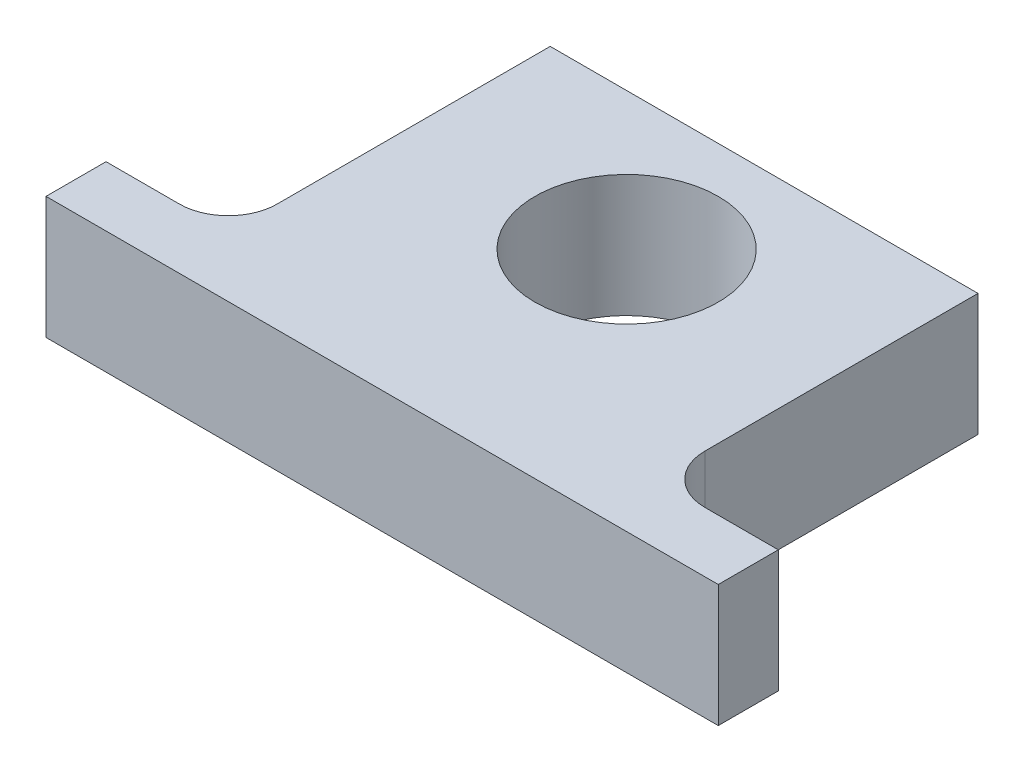
ISO-10303-21;
HEADER;
FILE_DESCRIPTION(('STEP AP214'),'2;1');
FILE_NAME('part.step','',(''),(''),'','','');
FILE_SCHEMA(('AUTOMOTIVE_DESIGN { 1 0 10303 214 1 1 1 1 }'));
ENDSEC;
DATA;
#1=APPLICATION_CONTEXT('core data for automotive mechanical design processes');
#2=APPLICATION_PROTOCOL_DEFINITION('international standard','automotive_design',2000,#1);
#3=PRODUCT_CONTEXT('',#1,'mechanical');
#4=PRODUCT('Part','Part','',(#3));
#5=PRODUCT_RELATED_PRODUCT_CATEGORY('part','',(#4));
#6=PRODUCT_DEFINITION_FORMATION('','',#4);
#7=PRODUCT_DEFINITION_CONTEXT('part definition',#1,'design');
#8=PRODUCT_DEFINITION('design','',#6,#7);
#9=PRODUCT_DEFINITION_SHAPE('','',#8);
#10=(LENGTH_UNIT() NAMED_UNIT(*) SI_UNIT(.MILLI.,.METRE.));
#11=(NAMED_UNIT(*) PLANE_ANGLE_UNIT() SI_UNIT($,.RADIAN.));
#12=(NAMED_UNIT(*) SI_UNIT($,.STERADIAN.) SOLID_ANGLE_UNIT());
#13=UNCERTAINTY_MEASURE_WITH_UNIT(LENGTH_MEASURE(1.E-05),#10,'distance_accuracy_value','');
#14=(GEOMETRIC_REPRESENTATION_CONTEXT(3) GLOBAL_UNCERTAINTY_ASSIGNED_CONTEXT((#13)) GLOBAL_UNIT_ASSIGNED_CONTEXT((#10,
#11,#12)) REPRESENTATION_CONTEXT('',''));
#15=CARTESIAN_POINT('',(0.,0.,0.));
#16=DIRECTION('',(0.,0.,1.));
#17=DIRECTION('',(1.,0.,0.));
#18=AXIS2_PLACEMENT_3D('',#15,#16,#17);
#19=CARTESIAN_POINT('',(-27.305,12.7,8.52556898106456));
#20=DIRECTION('',(0.,1.,0.));
#21=DIRECTION('',(0.,0.,1.));
#22=AXIS2_PLACEMENT_3D('',#19,#20,#21);
#23=PLANE('',#22);
#24=DIRECTION('',(0.,0.,-1.));
#25=VECTOR('',#24,1.);
#26=CARTESIAN_POINT('',(34.925,12.7,13.6055689810646));
#27=LINE('',#26,#25);
#28=CARTESIAN_POINT('',(34.925,12.7,19.84375));
#29=VERTEX_POINT('',#28);
#30=CARTESIAN_POINT('',(34.925,12.7,13.6055689810646));
#31=VERTEX_POINT('',#30);
#32=EDGE_CURVE('E160',#29,#31,#27,.T.);
#33=ORIENTED_EDGE('',*,*,#32,.T.);
#34=DIRECTION('',(-1.,0.,0.));
#35=VECTOR('',#34,1.);
#36=CARTESIAN_POINT('',(27.305,12.7,13.6055689810646));
#37=LINE('',#36,#35);
#38=CARTESIAN_POINT('',(27.305,12.7,13.6055689810646));
#39=VERTEX_POINT('',#38);
#40=EDGE_CURVE('E98',#31,#39,#37,.T.);
#41=ORIENTED_EDGE('',*,*,#40,.T.);
#42=CARTESIAN_POINT('',(27.305,12.7,8.52556898106455));
#43=DIRECTION('',(0.,-1.,0.));
#44=DIRECTION('',(0.,0.,-1.));
#45=AXIS2_PLACEMENT_3D('',#42,#43,#44);
#46=CIRCLE('',#45,5.08);
#47=CARTESIAN_POINT('',(22.225,12.7,8.52556898106452));
#48=VERTEX_POINT('',#47);
#49=EDGE_CURVE('E181',#39,#48,#46,.T.);
#50=ORIENTED_EDGE('',*,*,#49,.T.);
#51=DIRECTION('',(0.,0.,-1.));
#52=VECTOR('',#51,1.);
#53=CARTESIAN_POINT('',(22.225,12.7,8.52556898106452));
#54=LINE('',#53,#52);
#55=CARTESIAN_POINT('',(22.225,12.7,-19.84375));
#56=VERTEX_POINT('',#55);
#57=EDGE_CURVE('E200',#48,#56,#54,.T.);
#58=ORIENTED_EDGE('',*,*,#57,.T.);
#59=DIRECTION('',(-1.,0.,0.));
#60=VECTOR('',#59,1.);
#61=CARTESIAN_POINT('',(-22.225,12.7,-19.84375));
#62=LINE('',#61,#60);
#63=CARTESIAN_POINT('',(-22.225,12.7,-19.84375));
#64=VERTEX_POINT('',#63);
#65=EDGE_CURVE('E197',#56,#64,#62,.T.);
#66=ORIENTED_EDGE('',*,*,#65,.T.);
#67=DIRECTION('',(0.,0.,1.));
#68=VECTOR('',#67,1.);
#69=CARTESIAN_POINT('',(-22.225,12.7,-19.84375));
#70=LINE('',#69,#68);
#71=CARTESIAN_POINT('',(-22.225,12.7,8.52556898106452));
#72=VERTEX_POINT('',#71);
#73=EDGE_CURVE('E199',#64,#72,#70,.T.);
#74=ORIENTED_EDGE('',*,*,#73,.T.);
#75=CARTESIAN_POINT('',(-27.305,12.7,8.52556898106456));
#76=DIRECTION('',(0.,-1.,0.));
#77=DIRECTION('',(0.,0.,1.));
#78=AXIS2_PLACEMENT_3D('',#75,#76,#77);
#79=CIRCLE('',#78,5.08);
#80=CARTESIAN_POINT('',(-27.305,12.7,13.6055689810646));
#81=VERTEX_POINT('',#80);
#82=EDGE_CURVE('E123',#72,#81,#79,.T.);
#83=ORIENTED_EDGE('',*,*,#82,.T.);
#84=DIRECTION('',(-1.,0.,0.));
#85=VECTOR('',#84,1.);
#86=CARTESIAN_POINT('',(-34.925,12.7,13.6055689810646));
#87=LINE('',#86,#85);
#88=CARTESIAN_POINT('',(-34.925,12.7,13.6055689810646));
#89=VERTEX_POINT('',#88);
#90=EDGE_CURVE('E117',#81,#89,#87,.T.);
#91=ORIENTED_EDGE('',*,*,#90,.T.);
#92=DIRECTION('',(0.,0.,1.));
#93=VECTOR('',#92,1.);
#94=CARTESIAN_POINT('',(-34.925,12.7,13.6055689810646));
#95=LINE('',#94,#93);
#96=CARTESIAN_POINT('',(-34.925,12.7,19.84375));
#97=VERTEX_POINT('',#96);
#98=EDGE_CURVE('E121',#89,#97,#95,.T.);
#99=ORIENTED_EDGE('',*,*,#98,.T.);
#100=DIRECTION('',(1.,0.,0.));
#101=VECTOR('',#100,1.);
#102=CARTESIAN_POINT('',(-34.925,12.7,19.84375));
#103=LINE('',#102,#101);
#104=EDGE_CURVE('E49',#97,#29,#103,.T.);
#105=ORIENTED_EDGE('',*,*,#104,.T.);
#106=EDGE_LOOP('',(#33,#41,#50,#58,#66,#74,#83,#91,#99,#105));
#107=FACE_BOUND('',#106,.T.);
#108=CARTESIAN_POINT('',(0.,12.7,-5.55625));
#109=DIRECTION('',(0.,1.,0.));
#110=DIRECTION('',(0.,0.,1.));
#111=AXIS2_PLACEMENT_3D('',#108,#109,#110);
#112=CIRCLE('',#111,9.525);
#113=CARTESIAN_POINT('',(0.,12.7,3.96875000000001));
#114=VERTEX_POINT('',#113);
#115=EDGE_CURVE('E145',#114,#114,#112,.T.);
#116=ORIENTED_EDGE('',*,*,#115,.F.);
#117=EDGE_LOOP('',(#116));
#118=FACE_BOUND('',#117,.T.);
#119=ADVANCED_FACE('F32',(#107,#118),#23,.T.);
#120=CARTESIAN_POINT('',(-27.305,0.,8.52556898106456));
#121=DIRECTION('',(0.,1.,0.));
#122=DIRECTION('',(0.,0.,1.));
#123=AXIS2_PLACEMENT_3D('',#120,#121,#122);
#124=PLANE('',#123);
#125=DIRECTION('',(0.,0.,-1.));
#126=VECTOR('',#125,1.);
#127=CARTESIAN_POINT('',(34.925,0.,13.6055689810646));
#128=LINE('',#127,#126);
#129=CARTESIAN_POINT('',(34.925,0.,19.84375));
#130=VERTEX_POINT('',#129);
#131=CARTESIAN_POINT('',(34.925,0.,13.6055689810646));
#132=VERTEX_POINT('',#131);
#133=EDGE_CURVE('E141',#130,#132,#128,.T.);
#134=ORIENTED_EDGE('',*,*,#133,.F.);
#135=DIRECTION('',(1.,0.,0.));
#136=VECTOR('',#135,1.);
#137=CARTESIAN_POINT('',(-34.925,0.,19.84375));
#138=LINE('',#137,#136);
#139=CARTESIAN_POINT('',(-34.925,0.,19.84375));
#140=VERTEX_POINT('',#139);
#141=EDGE_CURVE('E90',#140,#130,#138,.T.);
#142=ORIENTED_EDGE('',*,*,#141,.F.);
#143=DIRECTION('',(0.,0.,1.));
#144=VECTOR('',#143,1.);
#145=CARTESIAN_POINT('',(-34.925,0.,13.6055689810646));
#146=LINE('',#145,#144);
#147=CARTESIAN_POINT('',(-34.925,0.,13.6055689810646));
#148=VERTEX_POINT('',#147);
#149=EDGE_CURVE('E84',#148,#140,#146,.T.);
#150=ORIENTED_EDGE('',*,*,#149,.F.);
#151=DIRECTION('',(-1.,0.,0.));
#152=VECTOR('',#151,1.);
#153=CARTESIAN_POINT('',(-34.925,0.,13.6055689810646));
#154=LINE('',#153,#152);
#155=CARTESIAN_POINT('',(-27.305,0.,13.6055689810646));
#156=VERTEX_POINT('',#155);
#157=EDGE_CURVE('E131',#156,#148,#154,.T.);
#158=ORIENTED_EDGE('',*,*,#157,.F.);
#159=CARTESIAN_POINT('',(-27.305,0.,8.52556898106456));
#160=DIRECTION('',(0.,-1.,0.));
#161=DIRECTION('',(0.,0.,1.));
#162=AXIS2_PLACEMENT_3D('',#159,#160,#161);
#163=CIRCLE('',#162,5.08);
#164=CARTESIAN_POINT('',(-22.225,0.,8.52556898106452));
#165=VERTEX_POINT('',#164);
#166=EDGE_CURVE('E155',#165,#156,#163,.T.);
#167=ORIENTED_EDGE('',*,*,#166,.F.);
#168=DIRECTION('',(0.,0.,1.));
#169=VECTOR('',#168,1.);
#170=CARTESIAN_POINT('',(-22.225,0.,-19.84375));
#171=LINE('',#170,#169);
#172=CARTESIAN_POINT('',(-22.225,0.,-19.84375));
#173=VERTEX_POINT('',#172);
#174=EDGE_CURVE('E153',#173,#165,#171,.T.);
#175=ORIENTED_EDGE('',*,*,#174,.F.);
#176=DIRECTION('',(-1.,0.,0.));
#177=VECTOR('',#176,1.);
#178=CARTESIAN_POINT('',(-22.225,0.,-19.84375));
#179=LINE('',#178,#177);
#180=CARTESIAN_POINT('',(22.225,0.,-19.84375));
#181=VERTEX_POINT('',#180);
#182=EDGE_CURVE('E151',#181,#173,#179,.T.);
#183=ORIENTED_EDGE('',*,*,#182,.F.);
#184=DIRECTION('',(0.,0.,-1.));
#185=VECTOR('',#184,1.);
#186=CARTESIAN_POINT('',(22.225,0.,8.52556898106452));
#187=LINE('',#186,#185);
#188=CARTESIAN_POINT('',(22.225,0.,8.52556898106452));
#189=VERTEX_POINT('',#188);
#190=EDGE_CURVE('E149',#189,#181,#187,.T.);
#191=ORIENTED_EDGE('',*,*,#190,.F.);
#192=CARTESIAN_POINT('',(27.305,0.,8.52556898106455));
#193=DIRECTION('',(0.,-1.,0.));
#194=DIRECTION('',(0.,0.,-1.));
#195=AXIS2_PLACEMENT_3D('',#192,#193,#194);
#196=CIRCLE('',#195,5.08);
#197=CARTESIAN_POINT('',(27.305,0.,13.6055689810646));
#198=VERTEX_POINT('',#197);
#199=EDGE_CURVE('E147',#198,#189,#196,.T.);
#200=ORIENTED_EDGE('',*,*,#199,.F.);
#201=DIRECTION('',(-1.,0.,0.));
#202=VECTOR('',#201,1.);
#203=CARTESIAN_POINT('',(27.305,0.,13.6055689810646));
#204=LINE('',#203,#202);
#205=EDGE_CURVE('E144',#132,#198,#204,.T.);
#206=ORIENTED_EDGE('',*,*,#205,.F.);
#207=EDGE_LOOP('',(#134,#142,#150,#158,#167,#175,#183,#191,#200,#206));
#208=FACE_BOUND('',#207,.T.);
#209=CARTESIAN_POINT('',(0.,0.,-5.55625));
#210=DIRECTION('',(0.,1.,0.));
#211=DIRECTION('',(0.,0.,1.));
#212=AXIS2_PLACEMENT_3D('',#209,#210,#211);
#213=CIRCLE('',#212,9.525);
#214=CARTESIAN_POINT('',(0.,0.,3.96875000000001));
#215=VERTEX_POINT('',#214);
#216=EDGE_CURVE('E208',#215,#215,#213,.T.);
#217=ORIENTED_EDGE('',*,*,#216,.T.);
#218=EDGE_LOOP('',(#217));
#219=FACE_BOUND('',#218,.T.);
#220=ADVANCED_FACE('F185',(#208,#219),#124,.F.);
#221=CARTESIAN_POINT('',(34.925,12.7,13.6055689810646));
#222=DIRECTION('',(-1.,0.,0.));
#223=DIRECTION('',(0.,0.,1.));
#224=AXIS2_PLACEMENT_3D('',#221,#222,#223);
#225=PLANE('',#224);
#226=ORIENTED_EDGE('',*,*,#133,.T.);
#227=DIRECTION('',(0.,-1.,0.));
#228=VECTOR('',#227,1.);
#229=CARTESIAN_POINT('',(34.925,12.7,13.6055689810646));
#230=LINE('',#229,#228);
#231=EDGE_CURVE('E11',#31,#132,#230,.T.);
#232=ORIENTED_EDGE('',*,*,#231,.F.);
#233=ORIENTED_EDGE('',*,*,#32,.F.);
#234=DIRECTION('',(0.,-1.,0.));
#235=VECTOR('',#234,1.);
#236=CARTESIAN_POINT('',(34.925,12.7,19.84375));
#237=LINE('',#236,#235);
#238=EDGE_CURVE('E137',#29,#130,#237,.T.);
#239=ORIENTED_EDGE('',*,*,#238,.T.);
#240=EDGE_LOOP('',(#226,#232,#233,#239));
#241=FACE_BOUND('',#240,.T.);
#242=ADVANCED_FACE('F34',(#241),#225,.F.);
#243=CARTESIAN_POINT('',(27.305,12.7,13.6055689810646));
#244=DIRECTION('',(0.,0.,1.));
#245=DIRECTION('',(1.,0.,0.));
#246=AXIS2_PLACEMENT_3D('',#243,#244,#245);
#247=PLANE('',#246);
#248=ORIENTED_EDGE('',*,*,#205,.T.);
#249=DIRECTION('',(0.,-1.,0.));
#250=VECTOR('',#249,1.);
#251=CARTESIAN_POINT('',(27.305,12.7,13.6055689810646));
#252=LINE('',#251,#250);
#253=EDGE_CURVE('E41',#39,#198,#252,.T.);
#254=ORIENTED_EDGE('',*,*,#253,.F.);
#255=ORIENTED_EDGE('',*,*,#40,.F.);
#256=ORIENTED_EDGE('',*,*,#231,.T.);
#257=EDGE_LOOP('',(#248,#254,#255,#256));
#258=FACE_BOUND('',#257,.T.);
#259=ADVANCED_FACE('F244',(#258),#247,.F.);
#260=CARTESIAN_POINT('',(27.305,12.7,8.52556898106455));
#261=DIRECTION('',(0.,-1.,0.));
#262=DIRECTION('',(0.,0.,-1.));
#263=AXIS2_PLACEMENT_3D('',#260,#261,#262);
#264=CYLINDRICAL_SURFACE('',#263,5.08);
#265=ORIENTED_EDGE('',*,*,#199,.T.);
#266=DIRECTION('',(0.,-1.,0.));
#267=VECTOR('',#266,1.);
#268=CARTESIAN_POINT('',(22.225,12.7,8.52556898106452));
#269=LINE('',#268,#267);
#270=EDGE_CURVE('E173',#48,#189,#269,.T.);
#271=ORIENTED_EDGE('',*,*,#270,.F.);
#272=ORIENTED_EDGE('',*,*,#49,.F.);
#273=ORIENTED_EDGE('',*,*,#253,.T.);
#274=EDGE_LOOP('',(#265,#271,#272,#273));
#275=FACE_BOUND('',#274,.T.);
#276=ADVANCED_FACE('F179',(#275),#264,.F.);
#277=CARTESIAN_POINT('',(22.225,12.7,8.52556898106452));
#278=DIRECTION('',(-1.,0.,0.));
#279=DIRECTION('',(0.,0.,1.));
#280=AXIS2_PLACEMENT_3D('',#277,#278,#279);
#281=PLANE('',#280);
#282=ORIENTED_EDGE('',*,*,#190,.T.);
#283=DIRECTION('',(0.,-1.,0.));
#284=VECTOR('',#283,1.);
#285=CARTESIAN_POINT('',(22.225,12.7,-19.84375));
#286=LINE('',#285,#284);
#287=EDGE_CURVE('E170',#56,#181,#286,.T.);
#288=ORIENTED_EDGE('',*,*,#287,.F.);
#289=ORIENTED_EDGE('',*,*,#57,.F.);
#290=ORIENTED_EDGE('',*,*,#270,.T.);
#291=EDGE_LOOP('',(#282,#288,#289,#290));
#292=FACE_BOUND('',#291,.T.);
#293=ADVANCED_FACE('F191',(#292),#281,.F.);
#294=CARTESIAN_POINT('',(-22.225,12.7,-19.84375));
#295=DIRECTION('',(0.,0.,1.));
#296=DIRECTION('',(1.,0.,0.));
#297=AXIS2_PLACEMENT_3D('',#294,#295,#296);
#298=PLANE('',#297);
#299=ORIENTED_EDGE('',*,*,#182,.T.);
#300=DIRECTION('',(0.,-1.,0.));
#301=VECTOR('',#300,1.);
#302=CARTESIAN_POINT('',(-22.225,12.7,-19.84375));
#303=LINE('',#302,#301);
#304=EDGE_CURVE('E167',#64,#173,#303,.T.);
#305=ORIENTED_EDGE('',*,*,#304,.F.);
#306=ORIENTED_EDGE('',*,*,#65,.F.);
#307=ORIENTED_EDGE('',*,*,#287,.T.);
#308=EDGE_LOOP('',(#299,#305,#306,#307));
#309=FACE_BOUND('',#308,.T.);
#310=ADVANCED_FACE('F195',(#309),#298,.F.);
#311=CARTESIAN_POINT('',(-22.225,12.7,-19.84375));
#312=DIRECTION('',(1.,0.,0.));
#313=DIRECTION('',(0.,0.,-1.));
#314=AXIS2_PLACEMENT_3D('',#311,#312,#313);
#315=PLANE('',#314);
#316=ORIENTED_EDGE('',*,*,#174,.T.);
#317=DIRECTION('',(0.,-1.,0.));
#318=VECTOR('',#317,1.);
#319=CARTESIAN_POINT('',(-22.225,12.7,8.52556898106452));
#320=LINE('',#319,#318);
#321=EDGE_CURVE('E164',#72,#165,#320,.T.);
#322=ORIENTED_EDGE('',*,*,#321,.F.);
#323=ORIENTED_EDGE('',*,*,#73,.F.);
#324=ORIENTED_EDGE('',*,*,#304,.T.);
#325=EDGE_LOOP('',(#316,#322,#323,#324));
#326=FACE_BOUND('',#325,.T.);
#327=ADVANCED_FACE('F234',(#326),#315,.F.);
#328=CARTESIAN_POINT('',(-27.305,12.7,8.52556898106456));
#329=DIRECTION('',(0.,-1.,0.));
#330=DIRECTION('',(0.,0.,-1.));
#331=AXIS2_PLACEMENT_3D('',#328,#329,#330);
#332=CYLINDRICAL_SURFACE('',#331,5.08);
#333=ORIENTED_EDGE('',*,*,#166,.T.);
#334=DIRECTION('',(0.,-1.,0.));
#335=VECTOR('',#334,1.);
#336=CARTESIAN_POINT('',(-27.305,12.7,13.6055689810646));
#337=LINE('',#336,#335);
#338=EDGE_CURVE('E132',#81,#156,#337,.T.);
#339=ORIENTED_EDGE('',*,*,#338,.F.);
#340=ORIENTED_EDGE('',*,*,#82,.F.);
#341=ORIENTED_EDGE('',*,*,#321,.T.);
#342=EDGE_LOOP('',(#333,#339,#340,#341));
#343=FACE_BOUND('',#342,.T.);
#344=ADVANCED_FACE('F231',(#343),#332,.F.);
#345=CARTESIAN_POINT('',(-34.925,12.7,13.6055689810646));
#346=DIRECTION('',(0.,0.,1.));
#347=DIRECTION('',(1.,0.,0.));
#348=AXIS2_PLACEMENT_3D('',#345,#346,#347);
#349=PLANE('',#348);
#350=ORIENTED_EDGE('',*,*,#157,.T.);
#351=DIRECTION('',(0.,-1.,0.));
#352=VECTOR('',#351,1.);
#353=CARTESIAN_POINT('',(-34.925,12.7,13.6055689810646));
#354=LINE('',#353,#352);
#355=EDGE_CURVE('E128',#89,#148,#354,.T.);
#356=ORIENTED_EDGE('',*,*,#355,.F.);
#357=ORIENTED_EDGE('',*,*,#90,.F.);
#358=ORIENTED_EDGE('',*,*,#338,.T.);
#359=EDGE_LOOP('',(#350,#356,#357,#358));
#360=FACE_BOUND('',#359,.T.);
#361=ADVANCED_FACE('F129',(#360),#349,.F.);
#362=CARTESIAN_POINT('',(-34.925,12.7,13.6055689810646));
#363=DIRECTION('',(1.,0.,0.));
#364=DIRECTION('',(0.,0.,-1.));
#365=AXIS2_PLACEMENT_3D('',#362,#363,#364);
#366=PLANE('',#365);
#367=ORIENTED_EDGE('',*,*,#149,.T.);
#368=DIRECTION('',(0.,-1.,0.));
#369=VECTOR('',#368,1.);
#370=CARTESIAN_POINT('',(-34.925,12.7,19.84375));
#371=LINE('',#370,#369);
#372=EDGE_CURVE('E133',#97,#140,#371,.T.);
#373=ORIENTED_EDGE('',*,*,#372,.F.);
#374=ORIENTED_EDGE('',*,*,#98,.F.);
#375=ORIENTED_EDGE('',*,*,#355,.T.);
#376=EDGE_LOOP('',(#367,#373,#374,#375));
#377=FACE_BOUND('',#376,.T.);
#378=ADVANCED_FACE('F135',(#377),#366,.F.);
#379=CARTESIAN_POINT('',(-34.925,12.7,19.84375));
#380=DIRECTION('',(0.,0.,-1.));
#381=DIRECTION('',(-1.,0.,0.));
#382=AXIS2_PLACEMENT_3D('',#379,#380,#381);
#383=PLANE('',#382);
#384=ORIENTED_EDGE('',*,*,#141,.T.);
#385=ORIENTED_EDGE('',*,*,#238,.F.);
#386=ORIENTED_EDGE('',*,*,#104,.F.);
#387=ORIENTED_EDGE('',*,*,#372,.T.);
#388=EDGE_LOOP('',(#384,#385,#386,#387));
#389=FACE_BOUND('',#388,.T.);
#390=ADVANCED_FACE('F224',(#389),#383,.F.);
#391=CARTESIAN_POINT('',(0.,12.7,-5.55625));
#392=DIRECTION('',(0.,-1.,0.));
#393=DIRECTION('',(0.,0.,-1.));
#394=AXIS2_PLACEMENT_3D('',#391,#392,#393);
#395=CYLINDRICAL_SURFACE('',#394,9.525);
#396=ORIENTED_EDGE('',*,*,#115,.T.);
#397=EDGE_LOOP('',(#396));
#398=FACE_BOUND('',#397,.T.);
#399=ORIENTED_EDGE('',*,*,#216,.F.);
#400=EDGE_LOOP('',(#399));
#401=FACE_BOUND('',#400,.T.);
#402=ADVANCED_FACE('F214',(#398,#401),#395,.F.);
#403=CLOSED_SHELL('',(#119,#220,#242,#259,#276,#293,#310,#327,#344,#361,#378,#390,#402));
#404=MANIFOLD_SOLID_BREP('B2',#403);
#405=ADVANCED_BREP_SHAPE_REPRESENTATION('',(#18,#404),#14);
#406=SHAPE_DEFINITION_REPRESENTATION(#9,#405);
ENDSEC;
END-ISO-10303-21;
